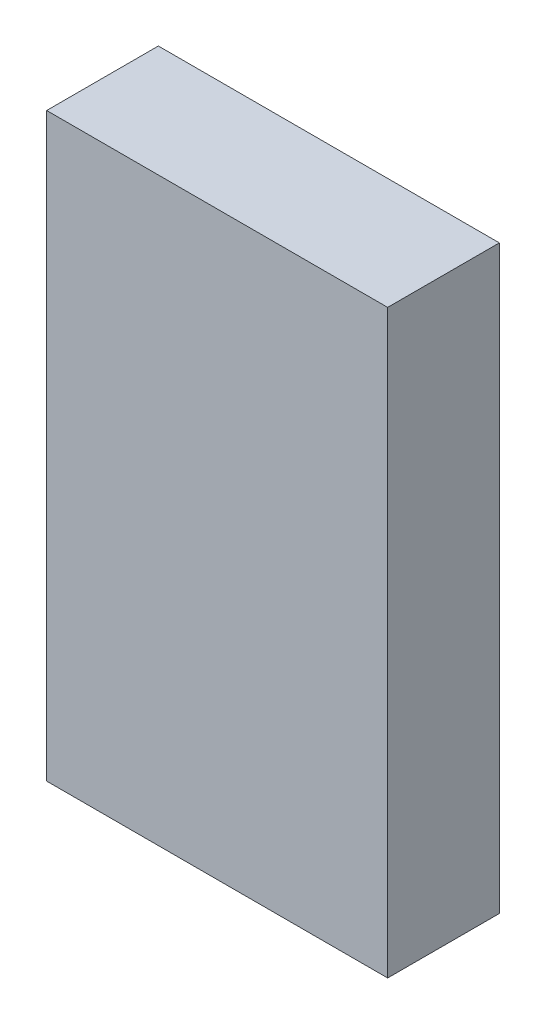
ISO-10303-21;
HEADER;
FILE_DESCRIPTION(('STEP AP214'),'2;1');
FILE_NAME('part.step','',(''),(''),'','','');
FILE_SCHEMA(('AUTOMOTIVE_DESIGN { 1 0 10303 214 1 1 1 1 }'));
ENDSEC;
DATA;
#1=APPLICATION_CONTEXT('core data for automotive mechanical design processes');
#2=APPLICATION_PROTOCOL_DEFINITION('international standard','automotive_design',2000,#1);
#3=PRODUCT_CONTEXT('',#1,'mechanical');
#4=PRODUCT('Part','Part','',(#3));
#5=PRODUCT_RELATED_PRODUCT_CATEGORY('part','',(#4));
#6=PRODUCT_DEFINITION_FORMATION('','',#4);
#7=PRODUCT_DEFINITION_CONTEXT('part definition',#1,'design');
#8=PRODUCT_DEFINITION('design','',#6,#7);
#9=PRODUCT_DEFINITION_SHAPE('','',#8);
#10=(LENGTH_UNIT() NAMED_UNIT(*) SI_UNIT(.MILLI.,.METRE.));
#11=(NAMED_UNIT(*) PLANE_ANGLE_UNIT() SI_UNIT($,.RADIAN.));
#12=(NAMED_UNIT(*) SI_UNIT($,.STERADIAN.) SOLID_ANGLE_UNIT());
#13=UNCERTAINTY_MEASURE_WITH_UNIT(LENGTH_MEASURE(1.E-05),#10,'distance_accuracy_value','');
#14=(GEOMETRIC_REPRESENTATION_CONTEXT(3) GLOBAL_UNCERTAINTY_ASSIGNED_CONTEXT((#13)) GLOBAL_UNIT_ASSIGNED_CONTEXT((#10,
#11,#12)) REPRESENTATION_CONTEXT('',''));
#15=CARTESIAN_POINT('',(0.,0.,0.));
#16=DIRECTION('',(0.,0.,1.));
#17=DIRECTION('',(1.,0.,0.));
#18=AXIS2_PLACEMENT_3D('',#15,#16,#17);
#19=CARTESIAN_POINT('',(-1.5266,2.6,1.));
#20=DIRECTION('',(0.,0.,1.));
#21=DIRECTION('',(1.,0.,0.));
#22=AXIS2_PLACEMENT_3D('',#19,#20,#21);
#23=PLANE('',#22);
#24=DIRECTION('',(0.,1.,0.));
#25=VECTOR('',#24,1.);
#26=CARTESIAN_POINT('',(1.5266,2.6,1.));
#27=LINE('',#26,#25);
#28=CARTESIAN_POINT('',(1.5266,2.6,1.));
#29=VERTEX_POINT('',#28);
#30=CARTESIAN_POINT('',(1.5266,-2.6,1.));
#31=VERTEX_POINT('',#30);
#32=EDGE_CURVE('E53',#29,#31,#27,.F.);
#33=ORIENTED_EDGE('',*,*,#32,.F.);
#34=DIRECTION('',(1.,0.,0.));
#35=VECTOR('',#34,1.);
#36=CARTESIAN_POINT('',(-1.5266,2.6,1.));
#37=LINE('',#36,#35);
#38=CARTESIAN_POINT('',(-1.5266,2.6,1.));
#39=VERTEX_POINT('',#38);
#40=EDGE_CURVE('E68',#39,#29,#37,.T.);
#41=ORIENTED_EDGE('',*,*,#40,.F.);
#42=DIRECTION('',(0.,1.,0.));
#43=VECTOR('',#42,1.);
#44=CARTESIAN_POINT('',(-1.5266,-2.6,1.));
#45=LINE('',#44,#43);
#46=CARTESIAN_POINT('',(-1.5266,-2.6,1.));
#47=VERTEX_POINT('',#46);
#48=EDGE_CURVE('E20',#47,#39,#45,.T.);
#49=ORIENTED_EDGE('',*,*,#48,.F.);
#50=DIRECTION('',(1.,0.,0.));
#51=VECTOR('',#50,1.);
#52=CARTESIAN_POINT('',(1.5266,-2.6,1.));
#53=LINE('',#52,#51);
#54=EDGE_CURVE('E58',#31,#47,#53,.F.);
#55=ORIENTED_EDGE('',*,*,#54,.F.);
#56=EDGE_LOOP('',(#33,#41,#49,#55));
#57=FACE_BOUND('',#56,.T.);
#58=ADVANCED_FACE('F17',(#57),#23,.T.);
#59=CARTESIAN_POINT('',(-1.5266,-2.6,0.));
#60=DIRECTION('',(-1.,0.,0.));
#61=DIRECTION('',(0.,0.,1.));
#62=AXIS2_PLACEMENT_3D('',#59,#60,#61);
#63=PLANE('',#62);
#64=DIRECTION('',(0.,0.,1.));
#65=VECTOR('',#64,1.);
#66=CARTESIAN_POINT('',(-1.5266,2.6,0.));
#67=LINE('',#66,#65);
#68=CARTESIAN_POINT('',(-1.5266,2.6,0.));
#69=VERTEX_POINT('',#68);
#70=EDGE_CURVE('E79',#69,#39,#67,.T.);
#71=ORIENTED_EDGE('',*,*,#70,.F.);
#72=DIRECTION('',(0.,1.,0.));
#73=VECTOR('',#72,1.);
#74=CARTESIAN_POINT('',(-1.5266,2.6,0.));
#75=LINE('',#74,#73);
#76=CARTESIAN_POINT('',(-1.5266,-2.6,0.));
#77=VERTEX_POINT('',#76);
#78=EDGE_CURVE('E74',#69,#77,#75,.F.);
#79=ORIENTED_EDGE('',*,*,#78,.T.);
#80=DIRECTION('',(0.,0.,-1.));
#81=VECTOR('',#80,1.);
#82=CARTESIAN_POINT('',(-1.5266,-2.6,0.));
#83=LINE('',#82,#81);
#84=EDGE_CURVE('E63',#47,#77,#83,.T.);
#85=ORIENTED_EDGE('',*,*,#84,.F.);
#86=ORIENTED_EDGE('',*,*,#48,.T.);
#87=EDGE_LOOP('',(#71,#79,#85,#86));
#88=FACE_BOUND('',#87,.T.);
#89=ADVANCED_FACE('F73',(#88),#63,.T.);
#90=CARTESIAN_POINT('',(1.5266,-2.6,0.));
#91=DIRECTION('',(0.,-1.,0.));
#92=DIRECTION('',(0.,0.,-1.));
#93=AXIS2_PLACEMENT_3D('',#90,#91,#92);
#94=PLANE('',#93);
#95=ORIENTED_EDGE('',*,*,#84,.T.);
#96=DIRECTION('',(1.,0.,0.));
#97=VECTOR('',#96,1.);
#98=CARTESIAN_POINT('',(-1.5266,-2.6,0.));
#99=LINE('',#98,#97);
#100=CARTESIAN_POINT('',(1.5266,-2.6,0.));
#101=VERTEX_POINT('',#100);
#102=EDGE_CURVE('E84',#77,#101,#99,.T.);
#103=ORIENTED_EDGE('',*,*,#102,.T.);
#104=DIRECTION('',(0.,0.,-1.));
#105=VECTOR('',#104,1.);
#106=CARTESIAN_POINT('',(1.5266,-2.6,0.));
#107=LINE('',#106,#105);
#108=EDGE_CURVE('E65',#31,#101,#107,.T.);
#109=ORIENTED_EDGE('',*,*,#108,.F.);
#110=ORIENTED_EDGE('',*,*,#54,.T.);
#111=EDGE_LOOP('',(#95,#103,#109,#110));
#112=FACE_BOUND('',#111,.T.);
#113=ADVANCED_FACE('F60',(#112),#94,.T.);
#114=CARTESIAN_POINT('',(1.5266,2.6,0.));
#115=DIRECTION('',(1.,0.,0.));
#116=DIRECTION('',(0.,0.,-1.));
#117=AXIS2_PLACEMENT_3D('',#114,#115,#116);
#118=PLANE('',#117);
#119=ORIENTED_EDGE('',*,*,#108,.T.);
#120=DIRECTION('',(0.,1.,0.));
#121=VECTOR('',#120,1.);
#122=CARTESIAN_POINT('',(1.5266,2.6,0.));
#123=LINE('',#122,#121);
#124=CARTESIAN_POINT('',(1.5266,2.6,0.));
#125=VERTEX_POINT('',#124);
#126=EDGE_CURVE('E26',#101,#125,#123,.T.);
#127=ORIENTED_EDGE('',*,*,#126,.T.);
#128=DIRECTION('',(0.,0.,1.));
#129=VECTOR('',#128,1.);
#130=CARTESIAN_POINT('',(1.5266,2.6,0.));
#131=LINE('',#130,#129);
#132=EDGE_CURVE('E34',#29,#125,#131,.F.);
#133=ORIENTED_EDGE('',*,*,#132,.F.);
#134=ORIENTED_EDGE('',*,*,#32,.T.);
#135=EDGE_LOOP('',(#119,#127,#133,#134));
#136=FACE_BOUND('',#135,.T.);
#137=ADVANCED_FACE('F88',(#136),#118,.T.);
#138=CARTESIAN_POINT('',(-1.5266,2.6,0.));
#139=DIRECTION('',(0.,1.,0.));
#140=DIRECTION('',(0.,0.,1.));
#141=AXIS2_PLACEMENT_3D('',#138,#139,#140);
#142=PLANE('',#141);
#143=ORIENTED_EDGE('',*,*,#132,.T.);
#144=DIRECTION('',(1.,0.,0.));
#145=VECTOR('',#144,1.);
#146=CARTESIAN_POINT('',(-1.5266,2.6,0.));
#147=LINE('',#146,#145);
#148=EDGE_CURVE('E11',#125,#69,#147,.F.);
#149=ORIENTED_EDGE('',*,*,#148,.T.);
#150=ORIENTED_EDGE('',*,*,#70,.T.);
#151=ORIENTED_EDGE('',*,*,#40,.T.);
#152=EDGE_LOOP('',(#143,#149,#150,#151));
#153=FACE_BOUND('',#152,.T.);
#154=ADVANCED_FACE('F91',(#153),#142,.T.);
#155=CARTESIAN_POINT('',(-1.5266,2.6,0.));
#156=DIRECTION('',(0.,0.,1.));
#157=DIRECTION('',(1.,0.,0.));
#158=AXIS2_PLACEMENT_3D('',#155,#156,#157);
#159=PLANE('',#158);
#160=ORIENTED_EDGE('',*,*,#126,.F.);
#161=ORIENTED_EDGE('',*,*,#102,.F.);
#162=ORIENTED_EDGE('',*,*,#78,.F.);
#163=ORIENTED_EDGE('',*,*,#148,.F.);
#164=EDGE_LOOP('',(#160,#161,#162,#163));
#165=FACE_BOUND('',#164,.T.);
#166=ADVANCED_FACE('F90',(#165),#159,.F.);
#167=CLOSED_SHELL('',(#58,#89,#113,#137,#154,#166));
#168=MANIFOLD_SOLID_BREP('B1',#167);
#169=ADVANCED_BREP_SHAPE_REPRESENTATION('',(#18,#168),#14);
#170=SHAPE_DEFINITION_REPRESENTATION(#9,#169);
ENDSEC;
END-ISO-10303-21;
